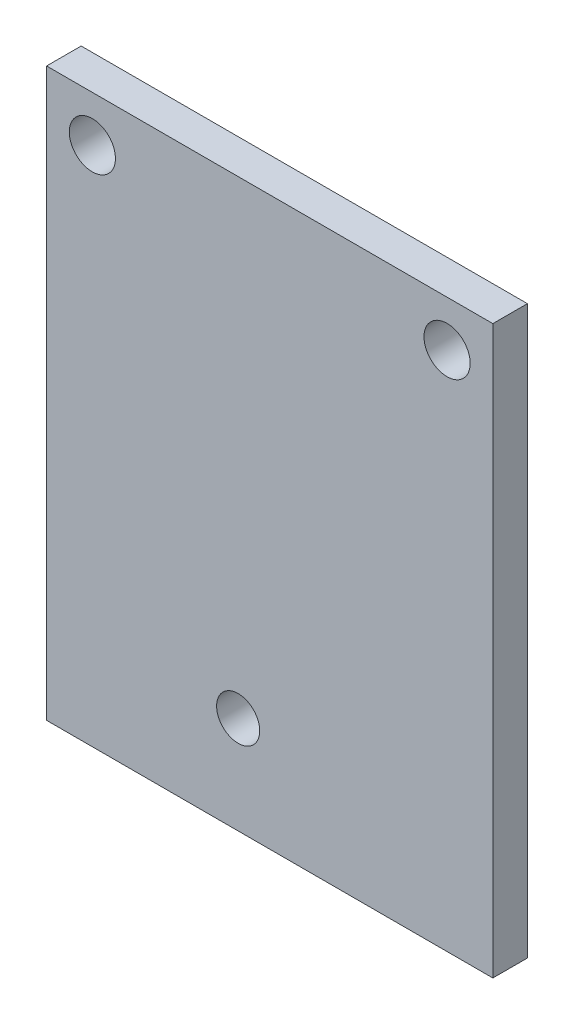
ISO-10303-21;
HEADER;
FILE_DESCRIPTION(('STEP AP214'),'2;1');
FILE_NAME('part.step','',(''),(''),'','','');
FILE_SCHEMA(('AUTOMOTIVE_DESIGN { 1 0 10303 214 1 1 1 1 }'));
ENDSEC;
DATA;
#1=APPLICATION_CONTEXT('core data for automotive mechanical design processes');
#2=APPLICATION_PROTOCOL_DEFINITION('international standard','automotive_design',2000,#1);
#3=PRODUCT_CONTEXT('',#1,'mechanical');
#4=PRODUCT('Part','Part','',(#3));
#5=PRODUCT_RELATED_PRODUCT_CATEGORY('part','',(#4));
#6=PRODUCT_DEFINITION_FORMATION('','',#4);
#7=PRODUCT_DEFINITION_CONTEXT('part definition',#1,'design');
#8=PRODUCT_DEFINITION('design','',#6,#7);
#9=PRODUCT_DEFINITION_SHAPE('','',#8);
#10=(LENGTH_UNIT() NAMED_UNIT(*) SI_UNIT(.MILLI.,.METRE.));
#11=(NAMED_UNIT(*) PLANE_ANGLE_UNIT() SI_UNIT($,.RADIAN.));
#12=(NAMED_UNIT(*) SI_UNIT($,.STERADIAN.) SOLID_ANGLE_UNIT());
#13=UNCERTAINTY_MEASURE_WITH_UNIT(LENGTH_MEASURE(1.E-05),#10,'distance_accuracy_value','');
#14=(GEOMETRIC_REPRESENTATION_CONTEXT(3) GLOBAL_UNCERTAINTY_ASSIGNED_CONTEXT((#13)) GLOBAL_UNIT_ASSIGNED_CONTEXT((#10,
#11,#12)) REPRESENTATION_CONTEXT('',''));
#15=CARTESIAN_POINT('',(0.,0.,0.));
#16=DIRECTION('',(0.,0.,1.));
#17=DIRECTION('',(1.,0.,0.));
#18=AXIS2_PLACEMENT_3D('',#15,#16,#17);
#19=CARTESIAN_POINT('',(-10.2500108,10.55,1.5494));
#20=DIRECTION('',(1.,0.,0.));
#21=DIRECTION('',(0.,1.,0.));
#22=AXIS2_PLACEMENT_3D('',#19,#20,#21);
#23=PLANE('',#22);
#24=DIRECTION('',(0.,-1.,0.));
#25=VECTOR('',#24,1.);
#26=CARTESIAN_POINT('',(-10.2500108,10.55,0.));
#27=LINE('',#26,#25);
#28=CARTESIAN_POINT('',(-10.2500108,10.55,0.));
#29=VERTEX_POINT('',#28);
#30=CARTESIAN_POINT('',(-10.2500108,-14.85,0.));
#31=VERTEX_POINT('',#30);
#32=EDGE_CURVE('E97',#29,#31,#27,.T.);
#33=ORIENTED_EDGE('',*,*,#32,.T.);
#34=DIRECTION('',(0.,0.,-1.));
#35=VECTOR('',#34,1.);
#36=CARTESIAN_POINT('',(-10.2500108,-14.85,1.5494));
#37=LINE('',#36,#35);
#38=CARTESIAN_POINT('',(-10.2500108,-14.85,1.5494));
#39=VERTEX_POINT('',#38);
#40=EDGE_CURVE('E11',#39,#31,#37,.T.);
#41=ORIENTED_EDGE('',*,*,#40,.F.);
#42=DIRECTION('',(0.,-1.,0.));
#43=VECTOR('',#42,1.);
#44=CARTESIAN_POINT('',(-10.2500108,10.55,1.5494));
#45=LINE('',#44,#43);
#46=CARTESIAN_POINT('',(-10.2500108,10.55,1.5494));
#47=VERTEX_POINT('',#46);
#48=EDGE_CURVE('E85',#47,#39,#45,.T.);
#49=ORIENTED_EDGE('',*,*,#48,.F.);
#50=DIRECTION('',(0.,0.,-1.));
#51=VECTOR('',#50,1.);
#52=CARTESIAN_POINT('',(-10.2500108,10.55,1.5494));
#53=LINE('',#52,#51);
#54=EDGE_CURVE('E93',#47,#29,#53,.T.);
#55=ORIENTED_EDGE('',*,*,#54,.T.);
#56=EDGE_LOOP('',(#33,#41,#49,#55));
#57=FACE_BOUND('',#56,.T.);
#58=ADVANCED_FACE('F34',(#57),#23,.F.);
#59=CARTESIAN_POINT('',(-10.2500108,-14.85,1.5494));
#60=DIRECTION('',(0.,1.,0.));
#61=DIRECTION('',(0.,0.,1.));
#62=AXIS2_PLACEMENT_3D('',#59,#60,#61);
#63=PLANE('',#62);
#64=DIRECTION('',(1.,0.,0.));
#65=VECTOR('',#64,1.);
#66=CARTESIAN_POINT('',(-10.2500108,-14.85,0.));
#67=LINE('',#66,#65);
#68=CARTESIAN_POINT('',(9.75000000000001,-14.85,0.));
#69=VERTEX_POINT('',#68);
#70=EDGE_CURVE('E89',#31,#69,#67,.T.);
#71=ORIENTED_EDGE('',*,*,#70,.T.);
#72=DIRECTION('',(0.,0.,-1.));
#73=VECTOR('',#72,1.);
#74=CARTESIAN_POINT('',(9.75000000000001,-14.85,1.5494));
#75=LINE('',#74,#73);
#76=CARTESIAN_POINT('',(9.75000000000001,-14.85,1.5494));
#77=VERTEX_POINT('',#76);
#78=EDGE_CURVE('E42',#77,#69,#75,.T.);
#79=ORIENTED_EDGE('',*,*,#78,.F.);
#80=DIRECTION('',(1.,0.,0.));
#81=VECTOR('',#80,1.);
#82=CARTESIAN_POINT('',(-10.2500108,-14.85,1.5494));
#83=LINE('',#82,#81);
#84=EDGE_CURVE('E80',#39,#77,#83,.T.);
#85=ORIENTED_EDGE('',*,*,#84,.F.);
#86=ORIENTED_EDGE('',*,*,#40,.T.);
#87=EDGE_LOOP('',(#71,#79,#85,#86));
#88=FACE_BOUND('',#87,.T.);
#89=ADVANCED_FACE('F88',(#88),#63,.F.);
#90=CARTESIAN_POINT('',(9.75,10.55,1.5494));
#91=DIRECTION('',(-1.,0.,0.));
#92=DIRECTION('',(0.,-1.,0.));
#93=AXIS2_PLACEMENT_3D('',#90,#91,#92);
#94=PLANE('',#93);
#95=DIRECTION('',(0.,1.,0.));
#96=VECTOR('',#95,1.);
#97=CARTESIAN_POINT('',(9.75,10.55,0.));
#98=LINE('',#97,#96);
#99=CARTESIAN_POINT('',(9.75,10.55,0.));
#100=VERTEX_POINT('',#99);
#101=EDGE_CURVE('E67',#69,#100,#98,.T.);
#102=ORIENTED_EDGE('',*,*,#101,.T.);
#103=DIRECTION('',(0.,0.,-1.));
#104=VECTOR('',#103,1.);
#105=CARTESIAN_POINT('',(9.75,10.55,1.5494));
#106=LINE('',#105,#104);
#107=CARTESIAN_POINT('',(9.75,10.55,1.5494));
#108=VERTEX_POINT('',#107);
#109=EDGE_CURVE('E90',#108,#100,#106,.T.);
#110=ORIENTED_EDGE('',*,*,#109,.F.);
#111=DIRECTION('',(0.,1.,0.));
#112=VECTOR('',#111,1.);
#113=CARTESIAN_POINT('',(9.75,10.55,1.5494));
#114=LINE('',#113,#112);
#115=EDGE_CURVE('E83',#77,#108,#114,.T.);
#116=ORIENTED_EDGE('',*,*,#115,.F.);
#117=ORIENTED_EDGE('',*,*,#78,.T.);
#118=EDGE_LOOP('',(#102,#110,#116,#117));
#119=FACE_BOUND('',#118,.T.);
#120=ADVANCED_FACE('F91',(#119),#94,.F.);
#121=CARTESIAN_POINT('',(-10.2500108,10.55,1.5494));
#122=DIRECTION('',(0.,-1.,0.));
#123=DIRECTION('',(1.,0.,0.));
#124=AXIS2_PLACEMENT_3D('',#121,#122,#123);
#125=PLANE('',#124);
#126=DIRECTION('',(-1.,0.,0.));
#127=VECTOR('',#126,1.);
#128=CARTESIAN_POINT('',(-10.2500108,10.55,0.));
#129=LINE('',#128,#127);
#130=EDGE_CURVE('E73',#100,#29,#129,.T.);
#131=ORIENTED_EDGE('',*,*,#130,.T.);
#132=ORIENTED_EDGE('',*,*,#54,.F.);
#133=DIRECTION('',(-1.,0.,0.));
#134=VECTOR('',#133,1.);
#135=CARTESIAN_POINT('',(-10.2500108,10.55,1.5494));
#136=LINE('',#135,#134);
#137=EDGE_CURVE('E50',#108,#47,#136,.T.);
#138=ORIENTED_EDGE('',*,*,#137,.F.);
#139=ORIENTED_EDGE('',*,*,#109,.T.);
#140=EDGE_LOOP('',(#131,#132,#138,#139));
#141=FACE_BOUND('',#140,.T.);
#142=ADVANCED_FACE('F105',(#141),#125,.F.);
#143=CARTESIAN_POINT('',(0.,0.,1.5494));
#144=DIRECTION('',(0.,0.,1.));
#145=DIRECTION('',(1.,0.,0.));
#146=AXIS2_PLACEMENT_3D('',#143,#144,#145);
#147=PLANE('',#146);
#148=CARTESIAN_POINT('',(-8.1989608,8.49895,1.5494));
#149=DIRECTION('',(0.,0.,-1.));
#150=DIRECTION('',(-1.,0.,0.));
#151=AXIS2_PLACEMENT_3D('',#148,#149,#150);
#152=CIRCLE('',#151,1.03505);
#153=CARTESIAN_POINT('',(-9.2340108,8.49895,1.5494));
#154=VERTEX_POINT('',#153);
#155=EDGE_CURVE('E100',#154,#154,#152,.T.);
#156=ORIENTED_EDGE('',*,*,#155,.T.);
#157=EDGE_LOOP('',(#156));
#158=FACE_BOUND('',#157,.T.);
#159=CARTESIAN_POINT('',(7.69895000000001,8.49895,1.5494));
#160=DIRECTION('',(0.,0.,-1.));
#161=DIRECTION('',(-1.,0.,0.));
#162=AXIS2_PLACEMENT_3D('',#159,#160,#161);
#163=CIRCLE('',#162,1.03505);
#164=CARTESIAN_POINT('',(6.66390000000001,8.49895,1.5494));
#165=VERTEX_POINT('',#164);
#166=EDGE_CURVE('E120',#165,#165,#163,.T.);
#167=ORIENTED_EDGE('',*,*,#166,.T.);
#168=EDGE_LOOP('',(#167));
#169=FACE_BOUND('',#168,.T.);
#170=CARTESIAN_POINT('',(-1.6648108,-10.4812,1.5494));
#171=DIRECTION('',(0.,0.,-1.));
#172=DIRECTION('',(-1.,0.,0.));
#173=AXIS2_PLACEMENT_3D('',#170,#171,#172);
#174=CIRCLE('',#173,0.965199999999999);
#175=CARTESIAN_POINT('',(-2.6300108,-10.4812,1.5494));
#176=VERTEX_POINT('',#175);
#177=EDGE_CURVE('E114',#176,#176,#174,.T.);
#178=ORIENTED_EDGE('',*,*,#177,.T.);
#179=EDGE_LOOP('',(#178));
#180=FACE_BOUND('',#179,.T.);
#181=ORIENTED_EDGE('',*,*,#48,.T.);
#182=ORIENTED_EDGE('',*,*,#84,.T.);
#183=ORIENTED_EDGE('',*,*,#115,.T.);
#184=ORIENTED_EDGE('',*,*,#137,.T.);
#185=EDGE_LOOP('',(#181,#182,#183,#184));
#186=FACE_BOUND('',#185,.T.);
#187=ADVANCED_FACE('F81',(#158,#169,#180,#186),#147,.T.);
#188=CARTESIAN_POINT('',(0.,0.,0.));
#189=DIRECTION('',(0.,0.,1.));
#190=DIRECTION('',(1.,0.,0.));
#191=AXIS2_PLACEMENT_3D('',#188,#189,#190);
#192=PLANE('',#191);
#193=CARTESIAN_POINT('',(-8.1989608,8.49895,0.));
#194=DIRECTION('',(0.,0.,-1.));
#195=DIRECTION('',(-1.,0.,0.));
#196=AXIS2_PLACEMENT_3D('',#193,#194,#195);
#197=CIRCLE('',#196,1.03505);
#198=CARTESIAN_POINT('',(-9.2340108,8.49895,0.));
#199=VERTEX_POINT('',#198);
#200=EDGE_CURVE('E123',#199,#199,#197,.T.);
#201=ORIENTED_EDGE('',*,*,#200,.F.);
#202=EDGE_LOOP('',(#201));
#203=FACE_BOUND('',#202,.T.);
#204=CARTESIAN_POINT('',(7.69895000000001,8.49895,0.));
#205=DIRECTION('',(0.,0.,-1.));
#206=DIRECTION('',(-1.,0.,0.));
#207=AXIS2_PLACEMENT_3D('',#204,#205,#206);
#208=CIRCLE('',#207,1.03505);
#209=CARTESIAN_POINT('',(6.66390000000001,8.49895,0.));
#210=VERTEX_POINT('',#209);
#211=EDGE_CURVE('E117',#210,#210,#208,.T.);
#212=ORIENTED_EDGE('',*,*,#211,.F.);
#213=EDGE_LOOP('',(#212));
#214=FACE_BOUND('',#213,.T.);
#215=CARTESIAN_POINT('',(-1.6648108,-10.4812,0.));
#216=DIRECTION('',(0.,0.,-1.));
#217=DIRECTION('',(-1.,0.,0.));
#218=AXIS2_PLACEMENT_3D('',#215,#216,#217);
#219=CIRCLE('',#218,0.965199999999999);
#220=CARTESIAN_POINT('',(-2.6300108,-10.4812,0.));
#221=VERTEX_POINT('',#220);
#222=EDGE_CURVE('E111',#221,#221,#219,.T.);
#223=ORIENTED_EDGE('',*,*,#222,.F.);
#224=EDGE_LOOP('',(#223));
#225=FACE_BOUND('',#224,.T.);
#226=ORIENTED_EDGE('',*,*,#32,.F.);
#227=ORIENTED_EDGE('',*,*,#130,.F.);
#228=ORIENTED_EDGE('',*,*,#101,.F.);
#229=ORIENTED_EDGE('',*,*,#70,.F.);
#230=EDGE_LOOP('',(#226,#227,#228,#229));
#231=FACE_BOUND('',#230,.T.);
#232=ADVANCED_FACE('F108',(#203,#214,#225,#231),#192,.F.);
#233=CARTESIAN_POINT('',(-1.6648108,-10.4812,1.5494));
#234=DIRECTION('',(0.,0.,-1.));
#235=DIRECTION('',(-1.,0.,0.));
#236=AXIS2_PLACEMENT_3D('',#233,#234,#235);
#237=CYLINDRICAL_SURFACE('',#236,0.965199999999999);
#238=ORIENTED_EDGE('',*,*,#177,.F.);
#239=EDGE_LOOP('',(#238));
#240=FACE_BOUND('',#239,.T.);
#241=ORIENTED_EDGE('',*,*,#222,.T.);
#242=EDGE_LOOP('',(#241));
#243=FACE_BOUND('',#242,.T.);
#244=ADVANCED_FACE('F140',(#240,#243),#237,.F.);
#245=CARTESIAN_POINT('',(7.69895000000001,8.49895,1.5494));
#246=DIRECTION('',(0.,0.,-1.));
#247=DIRECTION('',(-1.,0.,0.));
#248=AXIS2_PLACEMENT_3D('',#245,#246,#247);
#249=CYLINDRICAL_SURFACE('',#248,1.03505);
#250=ORIENTED_EDGE('',*,*,#166,.F.);
#251=EDGE_LOOP('',(#250));
#252=FACE_BOUND('',#251,.T.);
#253=ORIENTED_EDGE('',*,*,#211,.T.);
#254=EDGE_LOOP('',(#253));
#255=FACE_BOUND('',#254,.T.);
#256=ADVANCED_FACE('F134',(#252,#255),#249,.F.);
#257=CARTESIAN_POINT('',(-8.1989608,8.49895,1.5494));
#258=DIRECTION('',(0.,0.,-1.));
#259=DIRECTION('',(-1.,0.,0.));
#260=AXIS2_PLACEMENT_3D('',#257,#258,#259);
#261=CYLINDRICAL_SURFACE('',#260,1.03505);
#262=ORIENTED_EDGE('',*,*,#155,.F.);
#263=EDGE_LOOP('',(#262));
#264=FACE_BOUND('',#263,.T.);
#265=ORIENTED_EDGE('',*,*,#200,.T.);
#266=EDGE_LOOP('',(#265));
#267=FACE_BOUND('',#266,.T.);
#268=ADVANCED_FACE('F131',(#264,#267),#261,.F.);
#269=CLOSED_SHELL('',(#58,#89,#120,#142,#187,#232,#244,#256,#268));
#270=MANIFOLD_SOLID_BREP('B2',#269);
#271=ADVANCED_BREP_SHAPE_REPRESENTATION('',(#18,#270),#14);
#272=SHAPE_DEFINITION_REPRESENTATION(#9,#271);
ENDSEC;
END-ISO-10303-21;
